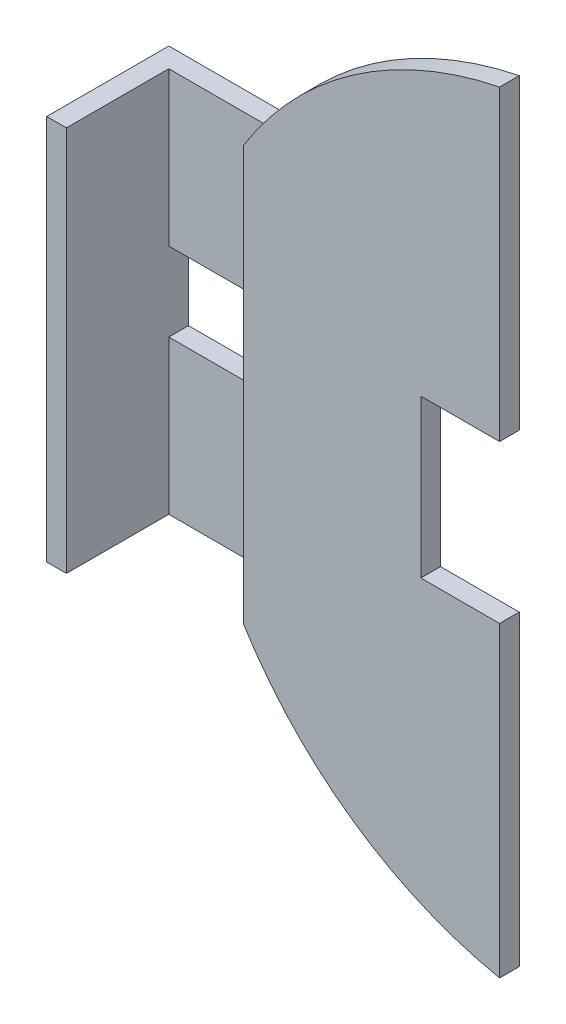
ISO-10303-21;
HEADER;
FILE_DESCRIPTION(('STEP AP214'),'2;1');
FILE_NAME('part.step','',(''),(''),'','','');
FILE_SCHEMA(('AUTOMOTIVE_DESIGN { 1 0 10303 214 1 1 1 1 }'));
ENDSEC;
DATA;
#1=APPLICATION_CONTEXT('core data for automotive mechanical design processes');
#2=APPLICATION_PROTOCOL_DEFINITION('international standard','automotive_design',2000,#1);
#3=PRODUCT_CONTEXT('',#1,'mechanical');
#4=PRODUCT('Part','Part','',(#3));
#5=PRODUCT_RELATED_PRODUCT_CATEGORY('part','',(#4));
#6=PRODUCT_DEFINITION_FORMATION('','',#4);
#7=PRODUCT_DEFINITION_CONTEXT('part definition',#1,'design');
#8=PRODUCT_DEFINITION('design','',#6,#7);
#9=PRODUCT_DEFINITION_SHAPE('','',#8);
#10=(LENGTH_UNIT() NAMED_UNIT(*) SI_UNIT(.MILLI.,.METRE.));
#11=(NAMED_UNIT(*) PLANE_ANGLE_UNIT() SI_UNIT($,.RADIAN.));
#12=(NAMED_UNIT(*) SI_UNIT($,.STERADIAN.) SOLID_ANGLE_UNIT());
#13=UNCERTAINTY_MEASURE_WITH_UNIT(LENGTH_MEASURE(1.E-05),#10,'distance_accuracy_value','');
#14=(GEOMETRIC_REPRESENTATION_CONTEXT(3) GLOBAL_UNCERTAINTY_ASSIGNED_CONTEXT((#13)) GLOBAL_UNIT_ASSIGNED_CONTEXT((#10,
#11,#12)) REPRESENTATION_CONTEXT('',''));
#15=CARTESIAN_POINT('',(0.,0.,0.));
#16=DIRECTION('',(0.,0.,1.));
#17=DIRECTION('',(1.,0.,0.));
#18=AXIS2_PLACEMENT_3D('',#15,#16,#17);
#19=CARTESIAN_POINT('',(6.,-2.45,0.02));
#20=DIRECTION('',(0.,-1.,0.));
#21=DIRECTION('',(0.,0.,-1.));
#22=AXIS2_PLACEMENT_3D('',#19,#20,#21);
#23=PLANE('',#22);
#24=DIRECTION('',(0.,0.,-1.));
#25=VECTOR('',#24,1.);
#26=CARTESIAN_POINT('',(-4.,-2.45,0.02));
#27=LINE('',#26,#25);
#28=CARTESIAN_POINT('',(-4.,-2.45,0.02));
#29=VERTEX_POINT('',#28);
#30=CARTESIAN_POINT('',(-4.,-2.45,0.57));
#31=VERTEX_POINT('',#30);
#32=EDGE_CURVE('E198',#29,#31,#27,.F.);
#33=ORIENTED_EDGE('',*,*,#32,.T.);
#34=DIRECTION('',(1.,0.,0.));
#35=VECTOR('',#34,1.);
#36=CARTESIAN_POINT('',(6.,-2.45,0.57));
#37=LINE('',#36,#35);
#38=CARTESIAN_POINT('',(-4.25,-2.45,0.57));
#39=VERTEX_POINT('',#38);
#40=EDGE_CURVE('E194',#31,#39,#37,.F.);
#41=ORIENTED_EDGE('',*,*,#40,.T.);
#42=DIRECTION('',(0.,0.,-1.));
#43=VECTOR('',#42,1.);
#44=CARTESIAN_POINT('',(-4.25,-2.45,0.02));
#45=LINE('',#44,#43);
#46=CARTESIAN_POINT('',(-4.25,-2.45,0.27));
#47=VERTEX_POINT('',#46);
#48=EDGE_CURVE('E69',#39,#47,#45,.T.);
#49=ORIENTED_EDGE('',*,*,#48,.T.);
#50=DIRECTION('',(1.,0.,0.));
#51=VECTOR('',#50,1.);
#52=CARTESIAN_POINT('',(6.,-2.45,0.27));
#53=LINE('',#52,#51);
#54=CARTESIAN_POINT('',(-5.75,-2.45,0.27));
#55=VERTEX_POINT('',#54);
#56=EDGE_CURVE('E199',#47,#55,#53,.F.);
#57=ORIENTED_EDGE('',*,*,#56,.T.);
#58=DIRECTION('',(0.,0.,-1.));
#59=VECTOR('',#58,1.);
#60=CARTESIAN_POINT('',(-5.75,-2.45,0.02));
#61=LINE('',#60,#59);
#62=CARTESIAN_POINT('',(-5.75,-2.45,1.57));
#63=VERTEX_POINT('',#62);
#64=EDGE_CURVE('E195',#55,#63,#61,.F.);
#65=ORIENTED_EDGE('',*,*,#64,.T.);
#66=DIRECTION('',(1.,0.,0.));
#67=VECTOR('',#66,1.);
#68=CARTESIAN_POINT('',(-6.,-2.45,1.57));
#69=LINE('',#68,#67);
#70=CARTESIAN_POINT('',(-6.,-2.45,1.57));
#71=VERTEX_POINT('',#70);
#72=EDGE_CURVE('E181',#71,#63,#69,.T.);
#73=ORIENTED_EDGE('',*,*,#72,.F.);
#74=DIRECTION('',(0.,0.,1.));
#75=VECTOR('',#74,1.);
#76=CARTESIAN_POINT('',(-6.,-2.45,0.02));
#77=LINE('',#76,#75);
#78=CARTESIAN_POINT('',(-6.,-2.45,0.02));
#79=VERTEX_POINT('',#78);
#80=EDGE_CURVE('E190',#79,#71,#77,.T.);
#81=ORIENTED_EDGE('',*,*,#80,.F.);
#82=DIRECTION('',(-1.,0.,0.));
#83=VECTOR('',#82,1.);
#84=CARTESIAN_POINT('',(-4.,-2.45,0.02));
#85=LINE('',#84,#83);
#86=EDGE_CURVE('E176',#29,#79,#85,.T.);
#87=ORIENTED_EDGE('',*,*,#86,.F.);
#88=EDGE_LOOP('',(#33,#41,#49,#57,#65,#73,#81,#87));
#89=FACE_BOUND('',#88,.T.);
#90=ADVANCED_FACE('F17',(#89),#23,.T.);
#91=CARTESIAN_POINT('',(-6.,-2.45,0.02));
#92=DIRECTION('',(-1.,0.,0.));
#93=DIRECTION('',(0.,0.,1.));
#94=AXIS2_PLACEMENT_3D('',#91,#92,#93);
#95=PLANE('',#94);
#96=DIRECTION('',(0.,0.,1.));
#97=VECTOR('',#96,1.);
#98=CARTESIAN_POINT('',(-6.,2.45,0.02));
#99=LINE('',#98,#97);
#100=CARTESIAN_POINT('',(-6.,2.45,0.02));
#101=VERTEX_POINT('',#100);
#102=CARTESIAN_POINT('',(-6.,2.45,1.57));
#103=VERTEX_POINT('',#102);
#104=EDGE_CURVE('E185',#101,#103,#99,.T.);
#105=ORIENTED_EDGE('',*,*,#104,.F.);
#106=DIRECTION('',(0.,1.,0.));
#107=VECTOR('',#106,1.);
#108=CARTESIAN_POINT('',(-6.,-2.45,0.02));
#109=LINE('',#108,#107);
#110=EDGE_CURVE('E173',#79,#101,#109,.T.);
#111=ORIENTED_EDGE('',*,*,#110,.F.);
#112=ORIENTED_EDGE('',*,*,#80,.T.);
#113=DIRECTION('',(0.,1.,0.));
#114=VECTOR('',#113,1.);
#115=CARTESIAN_POINT('',(-6.,-2.45,1.57));
#116=LINE('',#115,#114);
#117=EDGE_CURVE('E177',#103,#71,#116,.F.);
#118=ORIENTED_EDGE('',*,*,#117,.F.);
#119=EDGE_LOOP('',(#105,#111,#112,#118));
#120=FACE_BOUND('',#119,.T.);
#121=ADVANCED_FACE('F322',(#120),#95,.T.);
#122=CARTESIAN_POINT('',(6.,2.45,0.02));
#123=DIRECTION('',(0.,1.,0.));
#124=DIRECTION('',(0.,0.,1.));
#125=AXIS2_PLACEMENT_3D('',#122,#123,#124);
#126=PLANE('',#125);
#127=DIRECTION('',(1.,0.,0.));
#128=VECTOR('',#127,1.);
#129=CARTESIAN_POINT('',(6.,2.45,0.27));
#130=LINE('',#129,#128);
#131=CARTESIAN_POINT('',(-5.75,2.45,0.27));
#132=VERTEX_POINT('',#131);
#133=CARTESIAN_POINT('',(-4.25,2.45,0.27));
#134=VERTEX_POINT('',#133);
#135=EDGE_CURVE('E208',#132,#134,#130,.T.);
#136=ORIENTED_EDGE('',*,*,#135,.T.);
#137=DIRECTION('',(0.,0.,1.));
#138=VECTOR('',#137,1.);
#139=CARTESIAN_POINT('',(-4.25,2.45,0.02));
#140=LINE('',#139,#138);
#141=CARTESIAN_POINT('',(-4.25,2.45,0.57));
#142=VERTEX_POINT('',#141);
#143=EDGE_CURVE('E184',#134,#142,#140,.T.);
#144=ORIENTED_EDGE('',*,*,#143,.T.);
#145=DIRECTION('',(1.,0.,0.));
#146=VECTOR('',#145,1.);
#147=CARTESIAN_POINT('',(6.,2.45,0.57));
#148=LINE('',#147,#146);
#149=CARTESIAN_POINT('',(-4.,2.45,0.57));
#150=VERTEX_POINT('',#149);
#151=EDGE_CURVE('E193',#142,#150,#148,.T.);
#152=ORIENTED_EDGE('',*,*,#151,.T.);
#153=DIRECTION('',(0.,0.,1.));
#154=VECTOR('',#153,1.);
#155=CARTESIAN_POINT('',(-4.,2.45,0.02));
#156=LINE('',#155,#154);
#157=CARTESIAN_POINT('',(-4.,2.45,0.02));
#158=VERTEX_POINT('',#157);
#159=EDGE_CURVE('E189',#150,#158,#156,.F.);
#160=ORIENTED_EDGE('',*,*,#159,.T.);
#161=DIRECTION('',(-1.,0.,0.));
#162=VECTOR('',#161,1.);
#163=CARTESIAN_POINT('',(-4.,2.45,0.02));
#164=LINE('',#163,#162);
#165=EDGE_CURVE('E170',#101,#158,#164,.F.);
#166=ORIENTED_EDGE('',*,*,#165,.F.);
#167=ORIENTED_EDGE('',*,*,#104,.T.);
#168=DIRECTION('',(1.,0.,0.));
#169=VECTOR('',#168,1.);
#170=CARTESIAN_POINT('',(-6.,2.45,1.57));
#171=LINE('',#170,#169);
#172=CARTESIAN_POINT('',(-5.75,2.45,1.57));
#173=VERTEX_POINT('',#172);
#174=EDGE_CURVE('E180',#173,#103,#171,.F.);
#175=ORIENTED_EDGE('',*,*,#174,.F.);
#176=DIRECTION('',(0.,0.,1.));
#177=VECTOR('',#176,1.);
#178=CARTESIAN_POINT('',(-5.75,2.45,0.02));
#179=LINE('',#178,#177);
#180=EDGE_CURVE('E188',#173,#132,#179,.F.);
#181=ORIENTED_EDGE('',*,*,#180,.T.);
#182=EDGE_LOOP('',(#136,#144,#152,#160,#166,#167,#175,#181));
#183=FACE_BOUND('',#182,.T.);
#184=ADVANCED_FACE('F314',(#183),#126,.T.);
#185=CARTESIAN_POINT('',(-6.,-2.45,1.57));
#186=DIRECTION('',(0.,0.,1.));
#187=DIRECTION('',(1.,0.,0.));
#188=AXIS2_PLACEMENT_3D('',#185,#186,#187);
#189=PLANE('',#188);
#190=ORIENTED_EDGE('',*,*,#174,.T.);
#191=ORIENTED_EDGE('',*,*,#117,.T.);
#192=ORIENTED_EDGE('',*,*,#72,.T.);
#193=DIRECTION('',(0.,1.,0.));
#194=VECTOR('',#193,1.);
#195=CARTESIAN_POINT('',(-5.75,-2.499,1.57));
#196=LINE('',#195,#194);
#197=EDGE_CURVE('E159',#173,#63,#196,.F.);
#198=ORIENTED_EDGE('',*,*,#197,.F.);
#199=EDGE_LOOP('',(#190,#191,#192,#198));
#200=FACE_BOUND('',#199,.T.);
#201=ADVANCED_FACE('F275',(#200),#189,.T.);
#202=CARTESIAN_POINT('',(-4.,-2.45,0.02));
#203=DIRECTION('',(0.,0.,-1.));
#204=DIRECTION('',(-1.,0.,0.));
#205=AXIS2_PLACEMENT_3D('',#202,#203,#204);
#206=PLANE('',#205);
#207=DIRECTION('',(1.,0.,0.));
#208=VECTOR('',#207,1.);
#209=CARTESIAN_POINT('',(-5.75,-0.5,0.0200000000000001));
#210=LINE('',#209,#208);
#211=CARTESIAN_POINT('',(-4.75,-0.5,0.02));
#212=VERTEX_POINT('',#211);
#213=CARTESIAN_POINT('',(-5.75,-0.5,0.02));
#214=VERTEX_POINT('',#213);
#215=EDGE_CURVE('E160',#212,#214,#210,.F.);
#216=ORIENTED_EDGE('',*,*,#215,.F.);
#217=DIRECTION('',(0.,1.,0.));
#218=VECTOR('',#217,1.);
#219=CARTESIAN_POINT('',(-4.75,-0.5,0.0200000000000001));
#220=LINE('',#219,#218);
#221=CARTESIAN_POINT('',(-4.75,0.5,0.02));
#222=VERTEX_POINT('',#221);
#223=EDGE_CURVE('E166',#222,#212,#220,.F.);
#224=ORIENTED_EDGE('',*,*,#223,.F.);
#225=DIRECTION('',(1.,0.,0.));
#226=VECTOR('',#225,1.);
#227=CARTESIAN_POINT('',(-4.75,0.5,0.0200000000000001));
#228=LINE('',#227,#226);
#229=CARTESIAN_POINT('',(-5.75,0.5,0.02));
#230=VERTEX_POINT('',#229);
#231=EDGE_CURVE('E147',#230,#222,#228,.T.);
#232=ORIENTED_EDGE('',*,*,#231,.F.);
#233=DIRECTION('',(0.,1.,0.));
#234=VECTOR('',#233,1.);
#235=CARTESIAN_POINT('',(-5.75,-2.499,0.02));
#236=LINE('',#235,#234);
#237=EDGE_CURVE('E153',#214,#230,#236,.T.);
#238=ORIENTED_EDGE('',*,*,#237,.F.);
#239=EDGE_LOOP('',(#216,#224,#232,#238));
#240=FACE_BOUND('',#239,.T.);
#241=ORIENTED_EDGE('',*,*,#165,.T.);
#242=DIRECTION('',(0.,1.,0.));
#243=VECTOR('',#242,1.);
#244=CARTESIAN_POINT('',(-4.,-2.45,0.0200000000000001));
#245=LINE('',#244,#243);
#246=EDGE_CURVE('E169',#29,#158,#245,.T.);
#247=ORIENTED_EDGE('',*,*,#246,.F.);
#248=ORIENTED_EDGE('',*,*,#86,.T.);
#249=ORIENTED_EDGE('',*,*,#110,.T.);
#250=EDGE_LOOP('',(#241,#247,#248,#249));
#251=FACE_BOUND('',#250,.T.);
#252=ADVANCED_FACE('F376',(#240,#251),#206,.T.);
#253=CARTESIAN_POINT('',(-4.,-2.45,0.57));
#254=DIRECTION('',(1.,0.,0.));
#255=DIRECTION('',(0.,0.,-1.));
#256=AXIS2_PLACEMENT_3D('',#253,#254,#255);
#257=PLANE('',#256);
#258=ORIENTED_EDGE('',*,*,#159,.F.);
#259=DIRECTION('',(0.,1.,0.));
#260=VECTOR('',#259,1.);
#261=CARTESIAN_POINT('',(-4.,4.996959075278,0.57));
#262=LINE('',#261,#260);
#263=EDGE_CURVE('E73',#31,#150,#262,.T.);
#264=ORIENTED_EDGE('',*,*,#263,.F.);
#265=ORIENTED_EDGE('',*,*,#32,.F.);
#266=ORIENTED_EDGE('',*,*,#246,.T.);
#267=EDGE_LOOP('',(#258,#264,#265,#266));
#268=FACE_BOUND('',#267,.T.);
#269=ADVANCED_FACE('F379',(#268),#257,.T.);
#270=CARTESIAN_POINT('',(-4.75,-0.5,-1.43));
#271=DIRECTION('',(-1.,0.,0.));
#272=DIRECTION('',(0.,0.,1.));
#273=AXIS2_PLACEMENT_3D('',#270,#271,#272);
#274=PLANE('',#273);
#275=DIRECTION('',(0.,0.,1.));
#276=VECTOR('',#275,1.);
#277=CARTESIAN_POINT('',(-4.75,-0.5,-1.43));
#278=LINE('',#277,#276);
#279=CARTESIAN_POINT('',(-4.75,-0.5,0.27));
#280=VERTEX_POINT('',#279);
#281=EDGE_CURVE('E163',#280,#212,#278,.F.);
#282=ORIENTED_EDGE('',*,*,#281,.F.);
#283=DIRECTION('',(0.,1.,0.));
#284=VECTOR('',#283,1.);
#285=CARTESIAN_POINT('',(-4.75,-2.45,0.27));
#286=LINE('',#285,#284);
#287=CARTESIAN_POINT('',(-4.75,0.5,0.27));
#288=VERTEX_POINT('',#287);
#289=EDGE_CURVE('E110',#288,#280,#286,.F.);
#290=ORIENTED_EDGE('',*,*,#289,.F.);
#291=DIRECTION('',(0.,0.,-1.));
#292=VECTOR('',#291,1.);
#293=CARTESIAN_POINT('',(-4.75,0.5,-1.43));
#294=LINE('',#293,#292);
#295=EDGE_CURVE('E116',#222,#288,#294,.F.);
#296=ORIENTED_EDGE('',*,*,#295,.F.);
#297=ORIENTED_EDGE('',*,*,#223,.T.);
#298=EDGE_LOOP('',(#282,#290,#296,#297));
#299=FACE_BOUND('',#298,.T.);
#300=ADVANCED_FACE('F371',(#299),#274,.T.);
#301=CARTESIAN_POINT('',(-5.75,-0.5,-1.43));
#302=DIRECTION('',(0.,1.,0.));
#303=DIRECTION('',(0.,0.,1.));
#304=AXIS2_PLACEMENT_3D('',#301,#302,#303);
#305=PLANE('',#304);
#306=DIRECTION('',(0.,0.,-1.));
#307=VECTOR('',#306,1.);
#308=CARTESIAN_POINT('',(-5.75,-0.5,0.0045));
#309=LINE('',#308,#307);
#310=CARTESIAN_POINT('',(-5.75,-0.5,0.27));
#311=VERTEX_POINT('',#310);
#312=EDGE_CURVE('E156',#311,#214,#309,.T.);
#313=ORIENTED_EDGE('',*,*,#312,.F.);
#314=DIRECTION('',(1.,0.,0.));
#315=VECTOR('',#314,1.);
#316=CARTESIAN_POINT('',(-5.75,-0.5,0.27));
#317=LINE('',#316,#315);
#318=EDGE_CURVE('E107',#280,#311,#317,.F.);
#319=ORIENTED_EDGE('',*,*,#318,.F.);
#320=ORIENTED_EDGE('',*,*,#281,.T.);
#321=ORIENTED_EDGE('',*,*,#215,.T.);
#322=EDGE_LOOP('',(#313,#319,#320,#321));
#323=FACE_BOUND('',#322,.T.);
#324=ADVANCED_FACE('F366',(#323),#305,.T.);
#325=CARTESIAN_POINT('',(-5.75,-2.499,0.0045));
#326=DIRECTION('',(1.,0.,0.));
#327=DIRECTION('',(0.,0.,-1.));
#328=AXIS2_PLACEMENT_3D('',#325,#326,#327);
#329=PLANE('',#328);
#330=ORIENTED_EDGE('',*,*,#237,.T.);
#331=DIRECTION('',(0.,0.,-1.));
#332=VECTOR('',#331,1.);
#333=CARTESIAN_POINT('',(-5.75,0.5,-1.43));
#334=LINE('',#333,#332);
#335=CARTESIAN_POINT('',(-5.75,0.5,0.27));
#336=VERTEX_POINT('',#335);
#337=EDGE_CURVE('E150',#336,#230,#334,.T.);
#338=ORIENTED_EDGE('',*,*,#337,.F.);
#339=DIRECTION('',(0.,1.,0.));
#340=VECTOR('',#339,1.);
#341=CARTESIAN_POINT('',(-5.75,-2.45,0.27));
#342=LINE('',#341,#340);
#343=EDGE_CURVE('E103',#132,#336,#342,.F.);
#344=ORIENTED_EDGE('',*,*,#343,.F.);
#345=ORIENTED_EDGE('',*,*,#180,.F.);
#346=ORIENTED_EDGE('',*,*,#197,.T.);
#347=ORIENTED_EDGE('',*,*,#64,.F.);
#348=DIRECTION('',(0.,1.,0.));
#349=VECTOR('',#348,1.);
#350=CARTESIAN_POINT('',(-5.75,-2.45,0.27));
#351=LINE('',#350,#349);
#352=EDGE_CURVE('E104',#311,#55,#351,.F.);
#353=ORIENTED_EDGE('',*,*,#352,.F.);
#354=ORIENTED_EDGE('',*,*,#312,.T.);
#355=EDGE_LOOP('',(#330,#338,#344,#345,#346,#347,#353,#354));
#356=FACE_BOUND('',#355,.T.);
#357=ADVANCED_FACE('F266',(#356),#329,.T.);
#358=CARTESIAN_POINT('',(-4.75,0.5,-1.43));
#359=DIRECTION('',(0.,-1.,0.));
#360=DIRECTION('',(0.,0.,-1.));
#361=AXIS2_PLACEMENT_3D('',#358,#359,#360);
#362=PLANE('',#361);
#363=ORIENTED_EDGE('',*,*,#295,.T.);
#364=DIRECTION('',(1.,0.,0.));
#365=VECTOR('',#364,1.);
#366=CARTESIAN_POINT('',(-5.75,0.5,0.27));
#367=LINE('',#366,#365);
#368=EDGE_CURVE('E87',#336,#288,#367,.T.);
#369=ORIENTED_EDGE('',*,*,#368,.F.);
#370=ORIENTED_EDGE('',*,*,#337,.T.);
#371=ORIENTED_EDGE('',*,*,#231,.T.);
#372=EDGE_LOOP('',(#363,#369,#370,#371));
#373=FACE_BOUND('',#372,.T.);
#374=ADVANCED_FACE('F373',(#373),#362,.T.);
#375=CARTESIAN_POINT('',(-4.2825,4.996959075278,0.57));
#376=DIRECTION('',(0.,0.,-1.));
#377=DIRECTION('',(-1.,0.,0.));
#378=AXIS2_PLACEMENT_3D('',#375,#376,#377);
#379=PLANE('',#378);
#380=ORIENTED_EDGE('',*,*,#263,.T.);
#381=ORIENTED_EDGE('',*,*,#151,.F.);
#382=DIRECTION('',(0.,1.,0.));
#383=VECTOR('',#382,1.);
#384=CARTESIAN_POINT('',(-4.25,4.996959075278,0.57));
#385=LINE('',#384,#383);
#386=CARTESIAN_POINT('',(-4.25,2.63391343821327,0.57));
#387=VERTEX_POINT('',#386);
#388=EDGE_CURVE('E74',#142,#387,#385,.T.);
#389=ORIENTED_EDGE('',*,*,#388,.T.);
#390=CARTESIAN_POINT('',(0.,0.,0.57));
#391=DIRECTION('',(0.,0.,-1.));
#392=DIRECTION('',(-1.,0.,0.));
#393=AXIS2_PLACEMENT_3D('',#390,#391,#392);
#394=CIRCLE('',#393,5.00000000000018);
#395=CARTESIAN_POINT('',(-1.00000000000005,4.89897948556649,0.57));
#396=VERTEX_POINT('',#395);
#397=EDGE_CURVE('E96',#396,#387,#394,.F.);
#398=ORIENTED_EDGE('',*,*,#397,.F.);
#399=DIRECTION('',(0.,1.,0.));
#400=VECTOR('',#399,1.);
#401=CARTESIAN_POINT('',(-1.,7.,0.57));
#402=LINE('',#401,#400);
#403=CARTESIAN_POINT('',(-1.,1.,0.57));
#404=VERTEX_POINT('',#403);
#405=EDGE_CURVE('E119',#404,#396,#402,.T.);
#406=ORIENTED_EDGE('',*,*,#405,.F.);
#407=DIRECTION('',(1.,0.,0.));
#408=VECTOR('',#407,1.);
#409=CARTESIAN_POINT('',(2.,1.,0.57));
#410=LINE('',#409,#408);
#411=CARTESIAN_POINT('',(-2.,1.,0.57));
#412=VERTEX_POINT('',#411);
#413=EDGE_CURVE('E122',#412,#404,#410,.T.);
#414=ORIENTED_EDGE('',*,*,#413,.F.);
#415=DIRECTION('',(0.,1.,0.));
#416=VECTOR('',#415,1.);
#417=CARTESIAN_POINT('',(-2.,1.,0.57));
#418=LINE('',#417,#416);
#419=CARTESIAN_POINT('',(-2.,-1.,0.57));
#420=VERTEX_POINT('',#419);
#421=EDGE_CURVE('E130',#420,#412,#418,.T.);
#422=ORIENTED_EDGE('',*,*,#421,.F.);
#423=DIRECTION('',(1.,0.,0.));
#424=VECTOR('',#423,1.);
#425=CARTESIAN_POINT('',(-2.,-1.,0.57));
#426=LINE('',#425,#424);
#427=CARTESIAN_POINT('',(-1.,-1.,0.57));
#428=VERTEX_POINT('',#427);
#429=EDGE_CURVE('E136',#428,#420,#426,.F.);
#430=ORIENTED_EDGE('',*,*,#429,.F.);
#431=DIRECTION('',(0.,1.,0.));
#432=VECTOR('',#431,1.);
#433=CARTESIAN_POINT('',(-1.,7.,0.57));
#434=LINE('',#433,#432);
#435=CARTESIAN_POINT('',(-1.,-4.89897948556627,0.57));
#436=VERTEX_POINT('',#435);
#437=EDGE_CURVE('E83',#436,#428,#434,.T.);
#438=ORIENTED_EDGE('',*,*,#437,.F.);
#439=CARTESIAN_POINT('',(0.,0.,0.57));
#440=DIRECTION('',(0.,0.,-1.));
#441=DIRECTION('',(-1.,0.,0.));
#442=AXIS2_PLACEMENT_3D('',#439,#440,#441);
#443=CIRCLE('',#442,5.00000000000018);
#444=CARTESIAN_POINT('',(-4.25,-2.63391343821327,0.57));
#445=VERTEX_POINT('',#444);
#446=EDGE_CURVE('E78',#445,#436,#443,.F.);
#447=ORIENTED_EDGE('',*,*,#446,.F.);
#448=DIRECTION('',(0.,1.,0.));
#449=VECTOR('',#448,1.);
#450=CARTESIAN_POINT('',(-4.25,4.996959075278,0.57));
#451=LINE('',#450,#449);
#452=EDGE_CURVE('E61',#445,#39,#451,.T.);
#453=ORIENTED_EDGE('',*,*,#452,.T.);
#454=ORIENTED_EDGE('',*,*,#40,.F.);
#455=EDGE_LOOP('',(#380,#381,#389,#398,#406,#414,#422,#430,#438,#447,#453,#454));
#456=FACE_BOUND('',#455,.T.);
#457=ADVANCED_FACE('F80',(#456),#379,.T.);
#458=CARTESIAN_POINT('',(-5.75,-2.45,0.27));
#459=DIRECTION('',(0.,0.,1.));
#460=DIRECTION('',(1.,0.,0.));
#461=AXIS2_PLACEMENT_3D('',#458,#459,#460);
#462=PLANE('',#461);
#463=ORIENTED_EDGE('',*,*,#343,.T.);
#464=ORIENTED_EDGE('',*,*,#368,.T.);
#465=ORIENTED_EDGE('',*,*,#289,.T.);
#466=ORIENTED_EDGE('',*,*,#318,.T.);
#467=ORIENTED_EDGE('',*,*,#352,.T.);
#468=ORIENTED_EDGE('',*,*,#56,.F.);
#469=DIRECTION('',(0.,1.,0.));
#470=VECTOR('',#469,1.);
#471=CARTESIAN_POINT('',(-4.25,-2.686591706977,0.27));
#472=LINE('',#471,#470);
#473=EDGE_CURVE('E93',#134,#47,#472,.F.);
#474=ORIENTED_EDGE('',*,*,#473,.F.);
#475=ORIENTED_EDGE('',*,*,#135,.F.);
#476=EDGE_LOOP('',(#463,#464,#465,#466,#467,#468,#474,#475));
#477=FACE_BOUND('',#476,.T.);
#478=ADVANCED_FACE('F309',(#477),#462,.T.);
#479=CARTESIAN_POINT('',(0.,0.,0.82));
#480=DIRECTION('',(0.,0.,-1.));
#481=DIRECTION('',(-1.,0.,0.));
#482=AXIS2_PLACEMENT_3D('',#479,#480,#481);
#483=CYLINDRICAL_SURFACE('',#482,5.00000000000018);
#484=DIRECTION('',(0.,0.,-1.));
#485=VECTOR('',#484,1.);
#486=CARTESIAN_POINT('',(-1.,-4.898979485566,-0.18));
#487=LINE('',#486,#485);
#488=CARTESIAN_POINT('',(-1.,-4.89897948556627,0.82));
#489=VERTEX_POINT('',#488);
#490=EDGE_CURVE('E86',#489,#436,#487,.T.);
#491=ORIENTED_EDGE('',*,*,#490,.F.);
#492=CARTESIAN_POINT('',(0.,0.,0.82));
#493=DIRECTION('',(0.,0.,-1.));
#494=DIRECTION('',(-1.,0.,0.));
#495=AXIS2_PLACEMENT_3D('',#492,#493,#494);
#496=CIRCLE('',#495,5.00000000000018);
#497=CARTESIAN_POINT('',(-4.25,-2.63391343821327,0.82));
#498=VERTEX_POINT('',#497);
#499=EDGE_CURVE('E92',#498,#489,#496,.F.);
#500=ORIENTED_EDGE('',*,*,#499,.F.);
#501=DIRECTION('',(0.,0.,1.));
#502=VECTOR('',#501,1.);
#503=CARTESIAN_POINT('',(-4.25,-2.633913438213,0.26));
#504=LINE('',#503,#502);
#505=EDGE_CURVE('E65',#445,#498,#504,.T.);
#506=ORIENTED_EDGE('',*,*,#505,.F.);
#507=ORIENTED_EDGE('',*,*,#446,.T.);
#508=EDGE_LOOP('',(#491,#500,#506,#507));
#509=FACE_BOUND('',#508,.T.);
#510=ADVANCED_FACE('F90',(#509),#483,.T.);
#511=CARTESIAN_POINT('',(-1.,7.,-0.18));
#512=DIRECTION('',(1.,0.,0.));
#513=DIRECTION('',(0.,0.,-1.));
#514=AXIS2_PLACEMENT_3D('',#511,#512,#513);
#515=PLANE('',#514);
#516=ORIENTED_EDGE('',*,*,#437,.T.);
#517=DIRECTION('',(0.,0.,1.));
#518=VECTOR('',#517,1.);
#519=CARTESIAN_POINT('',(-1.,-1.,-0.18));
#520=LINE('',#519,#518);
#521=CARTESIAN_POINT('',(-1.,-1.,0.82));
#522=VERTEX_POINT('',#521);
#523=EDGE_CURVE('E139',#522,#428,#520,.F.);
#524=ORIENTED_EDGE('',*,*,#523,.F.);
#525=DIRECTION('',(0.,1.,0.));
#526=VECTOR('',#525,1.);
#527=CARTESIAN_POINT('',(-1.,4.996959075278,0.82));
#528=LINE('',#527,#526);
#529=EDGE_CURVE('E258',#489,#522,#528,.T.);
#530=ORIENTED_EDGE('',*,*,#529,.F.);
#531=ORIENTED_EDGE('',*,*,#490,.T.);
#532=EDGE_LOOP('',(#516,#524,#530,#531));
#533=FACE_BOUND('',#532,.T.);
#534=ADVANCED_FACE('F432',(#533),#515,.T.);
#535=CARTESIAN_POINT('',(-2.,-1.,-0.18));
#536=DIRECTION('',(0.,1.,0.));
#537=DIRECTION('',(0.,0.,1.));
#538=AXIS2_PLACEMENT_3D('',#535,#536,#537);
#539=PLANE('',#538);
#540=DIRECTION('',(0.,0.,-1.));
#541=VECTOR('',#540,1.);
#542=CARTESIAN_POINT('',(-2.,-1.,-0.18));
#543=LINE('',#542,#541);
#544=CARTESIAN_POINT('',(-2.,-1.,0.82));
#545=VERTEX_POINT('',#544);
#546=EDGE_CURVE('E133',#545,#420,#543,.T.);
#547=ORIENTED_EDGE('',*,*,#546,.F.);
#548=DIRECTION('',(1.,0.,0.));
#549=VECTOR('',#548,1.);
#550=CARTESIAN_POINT('',(-4.2825,-1.,0.82));
#551=LINE('',#550,#549);
#552=EDGE_CURVE('E412',#522,#545,#551,.F.);
#553=ORIENTED_EDGE('',*,*,#552,.F.);
#554=ORIENTED_EDGE('',*,*,#523,.T.);
#555=ORIENTED_EDGE('',*,*,#429,.T.);
#556=EDGE_LOOP('',(#547,#553,#554,#555));
#557=FACE_BOUND('',#556,.T.);
#558=ADVANCED_FACE('F428',(#557),#539,.T.);
#559=CARTESIAN_POINT('',(-2.,1.,-0.18));
#560=DIRECTION('',(1.,0.,0.));
#561=DIRECTION('',(0.,0.,-1.));
#562=AXIS2_PLACEMENT_3D('',#559,#560,#561);
#563=PLANE('',#562);
#564=DIRECTION('',(0.,0.,-1.));
#565=VECTOR('',#564,1.);
#566=CARTESIAN_POINT('',(-2.,1.,-0.18));
#567=LINE('',#566,#565);
#568=CARTESIAN_POINT('',(-2.,1.,0.82));
#569=VERTEX_POINT('',#568);
#570=EDGE_CURVE('E127',#569,#412,#567,.T.);
#571=ORIENTED_EDGE('',*,*,#570,.F.);
#572=DIRECTION('',(0.,1.,0.));
#573=VECTOR('',#572,1.);
#574=CARTESIAN_POINT('',(-2.,4.996959075278,0.82));
#575=LINE('',#574,#573);
#576=EDGE_CURVE('E403',#545,#569,#575,.T.);
#577=ORIENTED_EDGE('',*,*,#576,.F.);
#578=ORIENTED_EDGE('',*,*,#546,.T.);
#579=ORIENTED_EDGE('',*,*,#421,.T.);
#580=EDGE_LOOP('',(#571,#577,#578,#579));
#581=FACE_BOUND('',#580,.T.);
#582=ADVANCED_FACE('F436',(#581),#563,.T.);
#583=CARTESIAN_POINT('',(2.,1.,-0.18));
#584=DIRECTION('',(0.,-1.,0.));
#585=DIRECTION('',(0.,0.,-1.));
#586=AXIS2_PLACEMENT_3D('',#583,#584,#585);
#587=PLANE('',#586);
#588=DIRECTION('',(0.,0.,-1.));
#589=VECTOR('',#588,1.);
#590=CARTESIAN_POINT('',(-1.,1.,-0.18));
#591=LINE('',#590,#589);
#592=CARTESIAN_POINT('',(-1.,1.,0.82));
#593=VERTEX_POINT('',#592);
#594=EDGE_CURVE('E121',#593,#404,#591,.T.);
#595=ORIENTED_EDGE('',*,*,#594,.F.);
#596=DIRECTION('',(1.,0.,0.));
#597=VECTOR('',#596,1.);
#598=CARTESIAN_POINT('',(-4.2825,1.,0.82));
#599=LINE('',#598,#597);
#600=EDGE_CURVE('E397',#569,#593,#599,.T.);
#601=ORIENTED_EDGE('',*,*,#600,.F.);
#602=ORIENTED_EDGE('',*,*,#570,.T.);
#603=ORIENTED_EDGE('',*,*,#413,.T.);
#604=EDGE_LOOP('',(#595,#601,#602,#603));
#605=FACE_BOUND('',#604,.T.);
#606=ADVANCED_FACE('F443',(#605),#587,.T.);
#607=CARTESIAN_POINT('',(-1.,7.,-0.18));
#608=DIRECTION('',(1.,0.,0.));
#609=DIRECTION('',(0.,0.,-1.));
#610=AXIS2_PLACEMENT_3D('',#607,#608,#609);
#611=PLANE('',#610);
#612=DIRECTION('',(0.,1.,0.));
#613=VECTOR('',#612,1.);
#614=CARTESIAN_POINT('',(-1.,4.996959075278,0.82));
#615=LINE('',#614,#613);
#616=CARTESIAN_POINT('',(-1.00000000000005,4.89897948556649,0.82));
#617=VERTEX_POINT('',#616);
#618=EDGE_CURVE('E256',#593,#617,#615,.T.);
#619=ORIENTED_EDGE('',*,*,#618,.F.);
#620=ORIENTED_EDGE('',*,*,#594,.T.);
#621=ORIENTED_EDGE('',*,*,#405,.T.);
#622=DIRECTION('',(0.,0.,-1.));
#623=VECTOR('',#622,1.);
#624=CARTESIAN_POINT('',(-1.0000000000001,4.89897948556644,0.695));
#625=LINE('',#624,#623);
#626=EDGE_CURVE('E259',#617,#396,#625,.T.);
#627=ORIENTED_EDGE('',*,*,#626,.F.);
#628=EDGE_LOOP('',(#619,#620,#621,#627));
#629=FACE_BOUND('',#628,.T.);
#630=ADVANCED_FACE('F444',(#629),#611,.T.);
#631=CARTESIAN_POINT('',(0.,0.,0.82));
#632=DIRECTION('',(0.,0.,-1.));
#633=DIRECTION('',(-1.,0.,0.));
#634=AXIS2_PLACEMENT_3D('',#631,#632,#633);
#635=CYLINDRICAL_SURFACE('',#634,5.00000000000018);
#636=ORIENTED_EDGE('',*,*,#626,.T.);
#637=ORIENTED_EDGE('',*,*,#397,.T.);
#638=DIRECTION('',(0.,0.,1.));
#639=VECTOR('',#638,1.);
#640=CARTESIAN_POINT('',(-4.25,2.633913438213,0.26));
#641=LINE('',#640,#639);
#642=CARTESIAN_POINT('',(-4.25,2.63391343821327,0.82));
#643=VERTEX_POINT('',#642);
#644=EDGE_CURVE('E36',#643,#387,#641,.F.);
#645=ORIENTED_EDGE('',*,*,#644,.F.);
#646=CARTESIAN_POINT('',(0.,0.,0.82));
#647=DIRECTION('',(0.,0.,-1.));
#648=DIRECTION('',(-1.,0.,0.));
#649=AXIS2_PLACEMENT_3D('',#646,#647,#648);
#650=CIRCLE('',#649,5.00000000000018);
#651=EDGE_CURVE('E27',#617,#643,#650,.F.);
#652=ORIENTED_EDGE('',*,*,#651,.F.);
#653=EDGE_LOOP('',(#636,#637,#645,#652));
#654=FACE_BOUND('',#653,.T.);
#655=ADVANCED_FACE('F19',(#654),#635,.T.);
#656=CARTESIAN_POINT('',(-4.25,-2.686591706977,0.26));
#657=DIRECTION('',(-1.,0.,0.));
#658=DIRECTION('',(0.,0.,1.));
#659=AXIS2_PLACEMENT_3D('',#656,#657,#658);
#660=PLANE('',#659);
#661=ORIENTED_EDGE('',*,*,#644,.T.);
#662=ORIENTED_EDGE('',*,*,#388,.F.);
#663=ORIENTED_EDGE('',*,*,#143,.F.);
#664=ORIENTED_EDGE('',*,*,#473,.T.);
#665=ORIENTED_EDGE('',*,*,#48,.F.);
#666=ORIENTED_EDGE('',*,*,#452,.F.);
#667=ORIENTED_EDGE('',*,*,#505,.T.);
#668=DIRECTION('',(0.,1.,0.));
#669=VECTOR('',#668,1.);
#670=CARTESIAN_POINT('',(-4.25,4.996959075278,0.82));
#671=LINE('',#670,#669);
#672=EDGE_CURVE('E11',#643,#498,#671,.F.);
#673=ORIENTED_EDGE('',*,*,#672,.F.);
#674=EDGE_LOOP('',(#661,#662,#663,#664,#665,#666,#667,#673));
#675=FACE_BOUND('',#674,.T.);
#676=ADVANCED_FACE('F63',(#675),#660,.T.);
#677=CARTESIAN_POINT('',(-4.2825,4.996959075278,0.82));
#678=DIRECTION('',(0.,0.,1.));
#679=DIRECTION('',(1.,0.,0.));
#680=AXIS2_PLACEMENT_3D('',#677,#678,#679);
#681=PLANE('',#680);
#682=ORIENTED_EDGE('',*,*,#672,.T.);
#683=ORIENTED_EDGE('',*,*,#499,.T.);
#684=ORIENTED_EDGE('',*,*,#529,.T.);
#685=ORIENTED_EDGE('',*,*,#552,.T.);
#686=ORIENTED_EDGE('',*,*,#576,.T.);
#687=ORIENTED_EDGE('',*,*,#600,.T.);
#688=ORIENTED_EDGE('',*,*,#618,.T.);
#689=ORIENTED_EDGE('',*,*,#651,.T.);
#690=EDGE_LOOP('',(#682,#683,#684,#685,#686,#687,#688,#689));
#691=FACE_BOUND('',#690,.T.);
#692=ADVANCED_FACE('F385',(#691),#681,.T.);
#693=CLOSED_SHELL('',(#90,#121,#184,#201,#252,#269,#300,#324,#357,#374,#457,#478,#510,#534,#558,
#582,#606,#630,#655,#676,#692));
#694=MANIFOLD_SOLID_BREP('B1',#693);
#695=ADVANCED_BREP_SHAPE_REPRESENTATION('',(#18,#694),#14);
#696=SHAPE_DEFINITION_REPRESENTATION(#9,#695);
ENDSEC;
END-ISO-10303-21;
